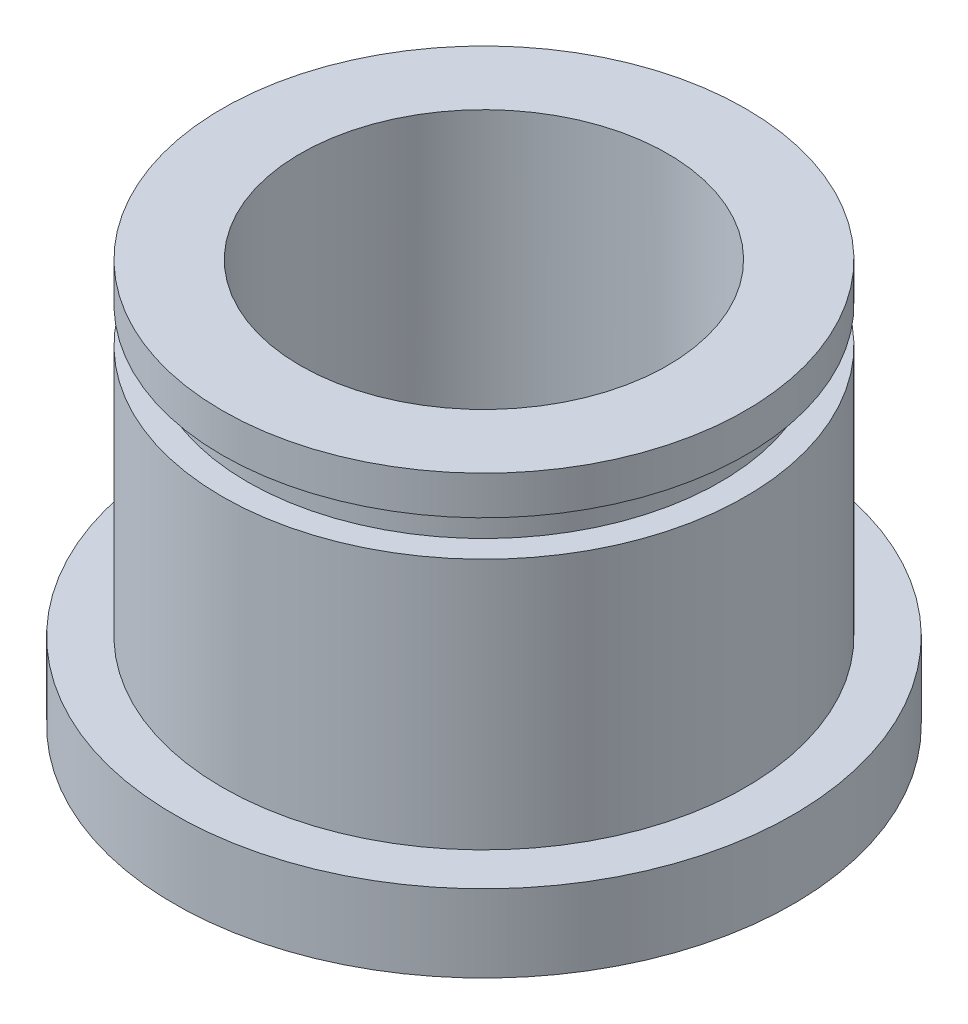
ISO-10303-21;
HEADER;
FILE_DESCRIPTION(('STEP AP214'),'2;1');
FILE_NAME('part.step','',(''),(''),'','','');
FILE_SCHEMA(('AUTOMOTIVE_DESIGN { 1 0 10303 214 1 1 1 1 }'));
ENDSEC;
DATA;
#1=APPLICATION_CONTEXT('core data for automotive mechanical design processes');
#2=APPLICATION_PROTOCOL_DEFINITION('international standard','automotive_design',2000,#1);
#3=PRODUCT_CONTEXT('',#1,'mechanical');
#4=PRODUCT('Part','Part','',(#3));
#5=PRODUCT_RELATED_PRODUCT_CATEGORY('part','',(#4));
#6=PRODUCT_DEFINITION_FORMATION('','',#4);
#7=PRODUCT_DEFINITION_CONTEXT('part definition',#1,'design');
#8=PRODUCT_DEFINITION('design','',#6,#7);
#9=PRODUCT_DEFINITION_SHAPE('','',#8);
#10=(LENGTH_UNIT() NAMED_UNIT(*) SI_UNIT(.MILLI.,.METRE.));
#11=(NAMED_UNIT(*) PLANE_ANGLE_UNIT() SI_UNIT($,.RADIAN.));
#12=(NAMED_UNIT(*) SI_UNIT($,.STERADIAN.) SOLID_ANGLE_UNIT());
#13=UNCERTAINTY_MEASURE_WITH_UNIT(LENGTH_MEASURE(1.E-05),#10,'distance_accuracy_value','');
#14=(GEOMETRIC_REPRESENTATION_CONTEXT(3) GLOBAL_UNCERTAINTY_ASSIGNED_CONTEXT((#13)) GLOBAL_UNIT_ASSIGNED_CONTEXT((#10,
#11,#12)) REPRESENTATION_CONTEXT('',''));
#15=CARTESIAN_POINT('',(0.,0.,0.));
#16=DIRECTION('',(0.,0.,1.));
#17=DIRECTION('',(1.,0.,0.));
#18=AXIS2_PLACEMENT_3D('',#15,#16,#17);
#19=CARTESIAN_POINT('',(0.,-4.143375,0.));
#20=DIRECTION('',(0.,1.,0.));
#21=DIRECTION('',(0.,0.,1.));
#22=AXIS2_PLACEMENT_3D('',#19,#20,#21);
#23=PLANE('',#22);
#24=CARTESIAN_POINT('',(0.,-4.143375,0.));
#25=DIRECTION('',(0.,1.,0.));
#26=DIRECTION('',(0.,0.,1.));
#27=AXIS2_PLACEMENT_3D('',#24,#25,#26);
#28=CIRCLE('',#27,4.56412599999999);
#29=CARTESIAN_POINT('',(0.,-4.143375,-4.56412599999999));
#30=VERTEX_POINT('',#29);
#31=EDGE_CURVE('E45',#30,#30,#28,.T.);
#32=ORIENTED_EDGE('',*,*,#31,.T.);
#33=EDGE_LOOP('',(#32));
#34=FACE_BOUND('',#33,.T.);
#35=CARTESIAN_POINT('',(0.,-4.143375,0.));
#36=DIRECTION('',(0.,-1.,0.));
#37=DIRECTION('',(0.,0.,-1.));
#38=AXIS2_PLACEMENT_3D('',#35,#36,#37);
#39=CIRCLE('',#38,6.35);
#40=CARTESIAN_POINT('',(0.,-4.143375,-6.35));
#41=VERTEX_POINT('',#40);
#42=EDGE_CURVE('E51',#41,#41,#39,.T.);
#43=ORIENTED_EDGE('',*,*,#42,.T.);
#44=EDGE_LOOP('',(#43));
#45=FACE_BOUND('',#44,.T.);
#46=ADVANCED_FACE('F37',(#34,#45),#23,.F.);
#47=CARTESIAN_POINT('',(0.,0.,0.));
#48=DIRECTION('',(0.,-1.,0.));
#49=DIRECTION('',(0.,0.,-1.));
#50=AXIS2_PLACEMENT_3D('',#47,#48,#49);
#51=CYLINDRICAL_SURFACE('',#50,6.35);
#52=ORIENTED_EDGE('',*,*,#42,.F.);
#53=EDGE_LOOP('',(#52));
#54=FACE_BOUND('',#53,.T.);
#55=CARTESIAN_POINT('',(0.,-2.555875,0.));
#56=DIRECTION('',(0.,-1.,0.));
#57=DIRECTION('',(0.,0.,-1.));
#58=AXIS2_PLACEMENT_3D('',#55,#56,#57);
#59=CIRCLE('',#58,6.35);
#60=CARTESIAN_POINT('',(0.,-2.555875,-6.35));
#61=VERTEX_POINT('',#60);
#62=EDGE_CURVE('E57',#61,#61,#59,.T.);
#63=ORIENTED_EDGE('',*,*,#62,.T.);
#64=EDGE_LOOP('',(#63));
#65=FACE_BOUND('',#64,.T.);
#66=ADVANCED_FACE('F114',(#54,#65),#51,.T.);
#67=CARTESIAN_POINT('',(0.,-2.555875,6.35));
#68=DIRECTION('',(0.,-1.,0.));
#69=DIRECTION('',(0.,0.,-1.));
#70=AXIS2_PLACEMENT_3D('',#67,#68,#69);
#71=PLANE('',#70);
#72=ORIENTED_EDGE('',*,*,#62,.F.);
#73=EDGE_LOOP('',(#72));
#74=FACE_BOUND('',#73,.T.);
#75=CARTESIAN_POINT('',(0.,-2.555875,0.));
#76=DIRECTION('',(0.,-1.,0.));
#77=DIRECTION('',(0.,0.,-1.));
#78=AXIS2_PLACEMENT_3D('',#75,#76,#77);
#79=CIRCLE('',#78,5.3721);
#80=CARTESIAN_POINT('',(0.,-2.555875,-5.3721));
#81=VERTEX_POINT('',#80);
#82=EDGE_CURVE('E63',#81,#81,#79,.T.);
#83=ORIENTED_EDGE('',*,*,#82,.T.);
#84=EDGE_LOOP('',(#83));
#85=FACE_BOUND('',#84,.T.);
#86=ADVANCED_FACE('F118',(#74,#85),#71,.F.);
#87=CARTESIAN_POINT('',(0.,0.,0.));
#88=DIRECTION('',(0.,-1.,0.));
#89=DIRECTION('',(0.,0.,-1.));
#90=AXIS2_PLACEMENT_3D('',#87,#88,#89);
#91=CYLINDRICAL_SURFACE('',#90,5.3721);
#92=ORIENTED_EDGE('',*,*,#82,.F.);
#93=EDGE_LOOP('',(#92));
#94=FACE_BOUND('',#93,.T.);
#95=CARTESIAN_POINT('',(0.,2.613025,0.));
#96=DIRECTION('',(0.,-1.,0.));
#97=DIRECTION('',(0.,0.,-1.));
#98=AXIS2_PLACEMENT_3D('',#95,#96,#97);
#99=CIRCLE('',#98,5.3721);
#100=CARTESIAN_POINT('',(0.,2.613025,-5.3721));
#101=VERTEX_POINT('',#100);
#102=EDGE_CURVE('E67',#101,#101,#99,.T.);
#103=ORIENTED_EDGE('',*,*,#102,.T.);
#104=EDGE_LOOP('',(#103));
#105=FACE_BOUND('',#104,.T.);
#106=ADVANCED_FACE('F125',(#94,#105),#91,.T.);
#107=CARTESIAN_POINT('',(0.,2.613025,5.3721));
#108=DIRECTION('',(0.,-1.,0.));
#109=DIRECTION('',(0.,0.,-1.));
#110=AXIS2_PLACEMENT_3D('',#107,#108,#109);
#111=PLANE('',#110);
#112=ORIENTED_EDGE('',*,*,#102,.F.);
#113=EDGE_LOOP('',(#112));
#114=FACE_BOUND('',#113,.T.);
#115=CARTESIAN_POINT('',(0.,2.613025,0.));
#116=DIRECTION('',(0.,-1.,0.));
#117=DIRECTION('',(0.,0.,-1.));
#118=AXIS2_PLACEMENT_3D('',#115,#116,#117);
#119=CIRCLE('',#118,4.8514);
#120=CARTESIAN_POINT('',(0.,2.613025,-4.8514));
#121=VERTEX_POINT('',#120);
#122=EDGE_CURVE('E71',#121,#121,#119,.T.);
#123=ORIENTED_EDGE('',*,*,#122,.T.);
#124=EDGE_LOOP('',(#123));
#125=FACE_BOUND('',#124,.T.);
#126=ADVANCED_FACE('F129',(#114,#125),#111,.F.);
#127=CARTESIAN_POINT('',(0.,0.,0.));
#128=DIRECTION('',(0.,-1.,0.));
#129=DIRECTION('',(0.,0.,-1.));
#130=AXIS2_PLACEMENT_3D('',#127,#128,#129);
#131=CYLINDRICAL_SURFACE('',#130,4.8514);
#132=ORIENTED_EDGE('',*,*,#122,.F.);
#133=EDGE_LOOP('',(#132));
#134=FACE_BOUND('',#133,.T.);
#135=CARTESIAN_POINT('',(0.,3.349625,0.));
#136=DIRECTION('',(0.,-1.,0.));
#137=DIRECTION('',(0.,0.,-1.));
#138=AXIS2_PLACEMENT_3D('',#135,#136,#137);
#139=CIRCLE('',#138,4.8514);
#140=CARTESIAN_POINT('',(0.,3.349625,-4.8514));
#141=VERTEX_POINT('',#140);
#142=EDGE_CURVE('E75',#141,#141,#139,.T.);
#143=ORIENTED_EDGE('',*,*,#142,.T.);
#144=EDGE_LOOP('',(#143));
#145=FACE_BOUND('',#144,.T.);
#146=ADVANCED_FACE('F109',(#134,#145),#131,.T.);
#147=CARTESIAN_POINT('',(0.,3.349625,4.8514));
#148=DIRECTION('',(0.,1.,0.));
#149=DIRECTION('',(0.,0.,1.));
#150=AXIS2_PLACEMENT_3D('',#147,#148,#149);
#151=PLANE('',#150);
#152=ORIENTED_EDGE('',*,*,#142,.F.);
#153=EDGE_LOOP('',(#152));
#154=FACE_BOUND('',#153,.T.);
#155=CARTESIAN_POINT('',(0.,3.349625,0.));
#156=DIRECTION('',(0.,-1.,0.));
#157=DIRECTION('',(0.,0.,-1.));
#158=AXIS2_PLACEMENT_3D('',#155,#156,#157);
#159=CIRCLE('',#158,5.3721);
#160=CARTESIAN_POINT('',(0.,3.349625,-5.3721));
#161=VERTEX_POINT('',#160);
#162=EDGE_CURVE('E79',#161,#161,#159,.T.);
#163=ORIENTED_EDGE('',*,*,#162,.T.);
#164=EDGE_LOOP('',(#163));
#165=FACE_BOUND('',#164,.T.);
#166=ADVANCED_FACE('F103',(#154,#165),#151,.F.);
#167=CARTESIAN_POINT('',(0.,0.,0.));
#168=DIRECTION('',(0.,-1.,0.));
#169=DIRECTION('',(0.,0.,-1.));
#170=AXIS2_PLACEMENT_3D('',#167,#168,#169);
#171=CYLINDRICAL_SURFACE('',#170,5.3721);
#172=ORIENTED_EDGE('',*,*,#162,.F.);
#173=EDGE_LOOP('',(#172));
#174=FACE_BOUND('',#173,.T.);
#175=CARTESIAN_POINT('',(0.,4.143375,0.));
#176=DIRECTION('',(0.,-1.,0.));
#177=DIRECTION('',(0.,0.,-1.));
#178=AXIS2_PLACEMENT_3D('',#175,#176,#177);
#179=CIRCLE('',#178,5.3721);
#180=CARTESIAN_POINT('',(0.,4.143375,-5.3721));
#181=VERTEX_POINT('',#180);
#182=EDGE_CURVE('E83',#181,#181,#179,.T.);
#183=ORIENTED_EDGE('',*,*,#182,.T.);
#184=EDGE_LOOP('',(#183));
#185=FACE_BOUND('',#184,.T.);
#186=ADVANCED_FACE('F98',(#174,#185),#171,.T.);
#187=CARTESIAN_POINT('',(0.,4.143375,5.3721));
#188=DIRECTION('',(0.,-1.,0.));
#189=DIRECTION('',(0.,0.,-1.));
#190=AXIS2_PLACEMENT_3D('',#187,#188,#189);
#191=PLANE('',#190);
#192=CARTESIAN_POINT('',(0.,4.143375,0.));
#193=DIRECTION('',(0.,1.,0.));
#194=DIRECTION('',(0.,0.,1.));
#195=AXIS2_PLACEMENT_3D('',#192,#193,#194);
#196=CIRCLE('',#195,3.77037599999999);
#197=CARTESIAN_POINT('',(0.,4.143375,3.77037599999999));
#198=VERTEX_POINT('',#197);
#199=EDGE_CURVE('E87',#198,#198,#196,.T.);
#200=ORIENTED_EDGE('',*,*,#199,.F.);
#201=EDGE_LOOP('',(#200));
#202=FACE_BOUND('',#201,.T.);
#203=ORIENTED_EDGE('',*,*,#182,.F.);
#204=EDGE_LOOP('',(#203));
#205=FACE_BOUND('',#204,.T.);
#206=ADVANCED_FACE('F95',(#202,#205),#191,.F.);
#207=CARTESIAN_POINT('',(0.,4.143375,0.));
#208=DIRECTION('',(0.,1.,0.));
#209=DIRECTION('',(0.,0.,1.));
#210=AXIS2_PLACEMENT_3D('',#207,#208,#209);
#211=CYLINDRICAL_SURFACE('',#210,3.77037599999999);
#212=CARTESIAN_POINT('',(0.,-3.349625,0.));
#213=DIRECTION('',(0.,1.,0.));
#214=DIRECTION('',(0.,0.,1.));
#215=AXIS2_PLACEMENT_3D('',#212,#213,#214);
#216=CIRCLE('',#215,3.77037599999999);
#217=CARTESIAN_POINT('',(0.,-3.349625,-3.77037599999999));
#218=VERTEX_POINT('',#217);
#219=EDGE_CURVE('E10',#218,#218,#216,.F.);
#220=ORIENTED_EDGE('',*,*,#219,.T.);
#221=EDGE_LOOP('',(#220));
#222=FACE_BOUND('',#221,.T.);
#223=ORIENTED_EDGE('',*,*,#199,.T.);
#224=EDGE_LOOP('',(#223));
#225=FACE_BOUND('',#224,.T.);
#226=ADVANCED_FACE('F93',(#222,#225),#211,.F.);
#227=CARTESIAN_POINT('',(0.,-4.143375,0.));
#228=DIRECTION('',(0.,-1.,0.));
#229=DIRECTION('',(0.,0.,-1.));
#230=AXIS2_PLACEMENT_3D('',#227,#228,#229);
#231=CONICAL_SURFACE('',#230,4.56412599999999,0.785398163397446);
#232=CARTESIAN_POINT('',(0.,-3.349625,-3.77037599999999));
#233=CARTESIAN_POINT('',(0.,-3.35789322916667,-3.77864422916666));
#234=CARTESIAN_POINT('',(0.,-3.36616145833333,-3.78691245833332));
#235=CARTESIAN_POINT('',(0.,-3.38269791666667,-3.80344891666666));
#236=CARTESIAN_POINT('',(0.,-3.39096614583333,-3.81171714583332));
#237=CARTESIAN_POINT('',(0.,-3.40750260416667,-3.82825360416666));
#238=CARTESIAN_POINT('',(0.,-3.41577083333333,-3.83652183333332));
#239=CARTESIAN_POINT('',(0.,-3.43230729166667,-3.85305829166666));
#240=CARTESIAN_POINT('',(0.,-3.44057552083333,-3.86132652083332));
#241=CARTESIAN_POINT('',(0.,-3.45711197916667,-3.87786297916666));
#242=CARTESIAN_POINT('',(0.,-3.46538020833333,-3.88613120833332));
#243=CARTESIAN_POINT('',(0.,-3.48191666666667,-3.90266766666666));
#244=CARTESIAN_POINT('',(0.,-3.49018489583333,-3.91093589583332));
#245=CARTESIAN_POINT('',(0.,-3.50672135416667,-3.92747235416666));
#246=CARTESIAN_POINT('',(0.,-3.51498958333333,-3.93574058333332));
#247=CARTESIAN_POINT('',(0.,-3.53152604166667,-3.95227704166666));
#248=CARTESIAN_POINT('',(0.,-3.53979427083333,-3.96054527083332));
#249=CARTESIAN_POINT('',(0.,-3.55633072916667,-3.97708172916666));
#250=CARTESIAN_POINT('',(0.,-3.56459895833333,-3.98534995833332));
#251=CARTESIAN_POINT('',(0.,-3.58113541666667,-4.00188641666665));
#252=CARTESIAN_POINT('',(0.,-3.58940364583333,-4.01015464583332));
#253=CARTESIAN_POINT('',(0.,-3.60594010416667,-4.02669110416666));
#254=CARTESIAN_POINT('',(0.,-3.61420833333333,-4.03495933333332));
#255=CARTESIAN_POINT('',(0.,-3.63074479166667,-4.05149579166666));
#256=CARTESIAN_POINT('',(0.,-3.63901302083333,-4.05976402083332));
#257=CARTESIAN_POINT('',(0.,-3.65554947916667,-4.07630047916666));
#258=CARTESIAN_POINT('',(0.,-3.66381770833333,-4.08456870833332));
#259=CARTESIAN_POINT('',(0.,-3.68035416666667,-4.10110516666666));
#260=CARTESIAN_POINT('',(0.,-3.68862239583333,-4.10937339583332));
#261=CARTESIAN_POINT('',(0.,-3.70515885416667,-4.12590985416666));
#262=CARTESIAN_POINT('',(0.,-3.71342708333333,-4.13417808333332));
#263=CARTESIAN_POINT('',(0.,-3.72996354166667,-4.15071454166666));
#264=CARTESIAN_POINT('',(0.,-3.73823177083333,-4.15898277083332));
#265=CARTESIAN_POINT('',(0.,-3.75476822916667,-4.17551922916665));
#266=CARTESIAN_POINT('',(0.,-3.76303645833333,-4.18378745833332));
#267=CARTESIAN_POINT('',(0.,-3.77957291666667,-4.20032391666666));
#268=CARTESIAN_POINT('',(0.,-3.78784114583333,-4.20859214583332));
#269=CARTESIAN_POINT('',(0.,-3.80437760416667,-4.22512860416666));
#270=CARTESIAN_POINT('',(0.,-3.81264583333333,-4.23339683333332));
#271=CARTESIAN_POINT('',(0.,-3.82918229166667,-4.24993329166666));
#272=CARTESIAN_POINT('',(0.,-3.83745052083333,-4.25820152083332));
#273=CARTESIAN_POINT('',(0.,-3.85398697916667,-4.27473797916666));
#274=CARTESIAN_POINT('',(0.,-3.86225520833333,-4.28300620833332));
#275=CARTESIAN_POINT('',(0.,-3.87879166666667,-4.29954266666665));
#276=CARTESIAN_POINT('',(0.,-3.88705989583333,-4.30781089583332));
#277=CARTESIAN_POINT('',(0.,-3.90359635416667,-4.32434735416666));
#278=CARTESIAN_POINT('',(0.,-3.91186458333333,-4.33261558333332));
#279=CARTESIAN_POINT('',(0.,-3.92840104166667,-4.34915204166666));
#280=CARTESIAN_POINT('',(0.,-3.93666927083333,-4.35742027083332));
#281=CARTESIAN_POINT('',(0.,-3.95320572916667,-4.37395672916665));
#282=CARTESIAN_POINT('',(0.,-3.96147395833333,-4.38222495833332));
#283=CARTESIAN_POINT('',(0.,-3.97801041666667,-4.39876141666666));
#284=CARTESIAN_POINT('',(0.,-3.98627864583333,-4.40702964583332));
#285=CARTESIAN_POINT('',(0.,-4.00281510416667,-4.42356610416665));
#286=CARTESIAN_POINT('',(0.,-4.01108333333333,-4.43183433333332));
#287=CARTESIAN_POINT('',(0.,-4.02761979166667,-4.44837079166666));
#288=CARTESIAN_POINT('',(0.,-4.03588802083333,-4.45663902083332));
#289=CARTESIAN_POINT('',(0.,-4.05242447916667,-4.47317547916666));
#290=CARTESIAN_POINT('',(0.,-4.06069270833333,-4.48144370833332));
#291=CARTESIAN_POINT('',(0.,-4.07722916666667,-4.49798016666665));
#292=CARTESIAN_POINT('',(0.,-4.08549739583333,-4.50624839583332));
#293=CARTESIAN_POINT('',(0.,-4.10203385416667,-4.52278485416666));
#294=CARTESIAN_POINT('',(0.,-4.11030208333333,-4.53105308333332));
#295=CARTESIAN_POINT('',(0.,-4.12683854166667,-4.54758954166665));
#296=CARTESIAN_POINT('',(0.,-4.13510677083334,-4.55585777083332));
#297=CARTESIAN_POINT('',(0.,-4.143375,-4.56412599999999));
#298=B_SPLINE_CURVE_WITH_KNOTS('',3,(#232,#233,#234,#235,#236,#237,#238,#239,#240,#241,#242,
#243,#244,#245,#246,#247,#248,#249,#250,#251,#252,#253,#254,#255,#256,#257,#258,#259,#260,#261,
#262,#263,#264,#265,#266,#267,#268,#269,#270,#271,#272,#273,#274,#275,#276,#277,#278,#279,#280,
#281,#282,#283,#284,#285,#286,#287,#288,#289,#290,#291,#292,#293,#294,#295,#296,#297),
.UNSPECIFIED.,.F.,.F.,(4,2,2,2,2,2,2,2,2,2,2,2,2,2,2,2,2,2,2,2,2,2,2,2,2,2,2,2,2,2,2,2,4),(0.,
0.0350791254729262,0.0701582509458527,0.105237376418779,0.140316501891706,0.175395627364632,
0.210474752837558,0.245553878310485,0.280633003783411,0.315712129256338,0.350791254729264,
0.38587038020219,0.420949505675117,0.456028631148044,0.49110775662097,0.526186882093896,
0.561266007566823,0.596345133039749,0.631424258512676,0.666503383985602,0.701582509458529,
0.736661634931455,0.771740760404381,0.806819885877308,0.841899011350235,0.87697813682316,
0.912057262296087,0.947136387769013,0.98221551324194,1.01729463871487,1.05237376418779,
1.08745288966072,1.12253201513365),.UNSPECIFIED.);
#299=EDGE_CURVE('BSEAM39',#218,#30,#298,.T.);
#300=ORIENTED_EDGE('',*,*,#219,.F.);
#301=ORIENTED_EDGE('',*,*,#31,.F.);
#302=ORIENTED_EDGE('',*,*,#299,.T.);
#303=ORIENTED_EDGE('',*,*,#299,.F.);
#304=EDGE_LOOP('',(#300,#302,#301,#303));
#305=FACE_BOUND('',#304,.T.);
#306=ADVANCED_FACE('F39',(#305),#231,.F.);
#307=CLOSED_SHELL('',(#46,#66,#86,#106,#126,#146,#166,#186,#206,#226,#306));
#308=MANIFOLD_SOLID_BREP('B2',#307);
#309=ADVANCED_BREP_SHAPE_REPRESENTATION('',(#18,#308),#14);
#310=SHAPE_DEFINITION_REPRESENTATION(#9,#309);
ENDSEC;
END-ISO-10303-21;
